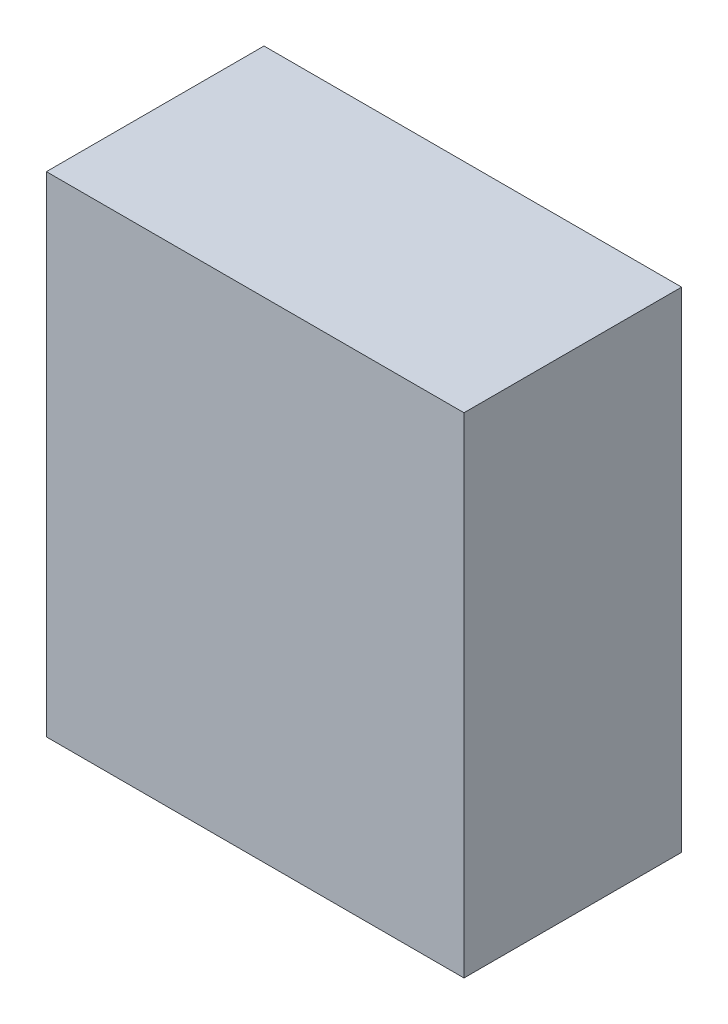
ISO-10303-21;
HEADER;
FILE_DESCRIPTION(('STEP AP214'),'2;1');
FILE_NAME('part.step','',(''),(''),'','','');
FILE_SCHEMA(('AUTOMOTIVE_DESIGN { 1 0 10303 214 1 1 1 1 }'));
ENDSEC;
DATA;
#1=APPLICATION_CONTEXT('core data for automotive mechanical design processes');
#2=APPLICATION_PROTOCOL_DEFINITION('international standard','automotive_design',2000,#1);
#3=PRODUCT_CONTEXT('',#1,'mechanical');
#4=PRODUCT('Part','Part','',(#3));
#5=PRODUCT_RELATED_PRODUCT_CATEGORY('part','',(#4));
#6=PRODUCT_DEFINITION_FORMATION('','',#4);
#7=PRODUCT_DEFINITION_CONTEXT('part definition',#1,'design');
#8=PRODUCT_DEFINITION('design','',#6,#7);
#9=PRODUCT_DEFINITION_SHAPE('','',#8);
#10=(LENGTH_UNIT() NAMED_UNIT(*) SI_UNIT(.MILLI.,.METRE.));
#11=(NAMED_UNIT(*) PLANE_ANGLE_UNIT() SI_UNIT($,.RADIAN.));
#12=(NAMED_UNIT(*) SI_UNIT($,.STERADIAN.) SOLID_ANGLE_UNIT());
#13=UNCERTAINTY_MEASURE_WITH_UNIT(LENGTH_MEASURE(1.E-05),#10,'distance_accuracy_value','');
#14=(GEOMETRIC_REPRESENTATION_CONTEXT(3) GLOBAL_UNCERTAINTY_ASSIGNED_CONTEXT((#13)) GLOBAL_UNIT_ASSIGNED_CONTEXT((#10,
#11,#12)) REPRESENTATION_CONTEXT('',''));
#15=CARTESIAN_POINT('',(0.,0.,0.));
#16=DIRECTION('',(0.,0.,1.));
#17=DIRECTION('',(1.,0.,0.));
#18=AXIS2_PLACEMENT_3D('',#15,#16,#17);
#19=CARTESIAN_POINT('',(4.50000116,-5.27500088,4.69));
#20=DIRECTION('',(0.,0.,-1.));
#21=DIRECTION('',(-1.,0.,0.));
#22=AXIS2_PLACEMENT_3D('',#19,#20,#21);
#23=PLANE('',#22);
#24=DIRECTION('',(1.,0.,0.));
#25=VECTOR('',#24,1.);
#26=CARTESIAN_POINT('',(4.50000116,5.27500088,4.69));
#27=LINE('',#26,#25);
#28=CARTESIAN_POINT('',(4.50000116,5.27500088,4.69));
#29=VERTEX_POINT('',#28);
#30=CARTESIAN_POINT('',(-4.49999862,5.27500088,4.69));
#31=VERTEX_POINT('',#30);
#32=EDGE_CURVE('E55',#29,#31,#27,.F.);
#33=ORIENTED_EDGE('',*,*,#32,.T.);
#34=DIRECTION('',(0.,1.,0.));
#35=VECTOR('',#34,1.);
#36=CARTESIAN_POINT('',(-4.49999862,5.27500088,4.69));
#37=LINE('',#36,#35);
#38=CARTESIAN_POINT('',(-4.49999862,-5.27500088,4.69));
#39=VERTEX_POINT('',#38);
#40=EDGE_CURVE('E57',#31,#39,#37,.F.);
#41=ORIENTED_EDGE('',*,*,#40,.T.);
#42=DIRECTION('',(1.,0.,0.));
#43=VECTOR('',#42,1.);
#44=CARTESIAN_POINT('',(-4.49999862,-5.27500088,4.69));
#45=LINE('',#44,#43);
#46=CARTESIAN_POINT('',(4.50000116,-5.27500088,4.69));
#47=VERTEX_POINT('',#46);
#48=EDGE_CURVE('E20',#39,#47,#45,.T.);
#49=ORIENTED_EDGE('',*,*,#48,.T.);
#50=DIRECTION('',(0.,1.,0.));
#51=VECTOR('',#50,1.);
#52=CARTESIAN_POINT('',(4.50000116,-5.27500088,4.69));
#53=LINE('',#52,#51);
#54=EDGE_CURVE('E80',#47,#29,#53,.T.);
#55=ORIENTED_EDGE('',*,*,#54,.T.);
#56=EDGE_LOOP('',(#33,#41,#49,#55));
#57=FACE_BOUND('',#56,.T.);
#58=ADVANCED_FACE('F17',(#57),#23,.F.);
#59=CARTESIAN_POINT('',(-4.49999862,-5.27500088,0.));
#60=DIRECTION('',(0.,1.,0.));
#61=DIRECTION('',(0.,0.,1.));
#62=AXIS2_PLACEMENT_3D('',#59,#60,#61);
#63=PLANE('',#62);
#64=DIRECTION('',(0.,0.,1.));
#65=VECTOR('',#64,1.);
#66=CARTESIAN_POINT('',(4.50000116,-5.27500088,0.));
#67=LINE('',#66,#65);
#68=CARTESIAN_POINT('',(4.50000116,-5.27500088,0.));
#69=VERTEX_POINT('',#68);
#70=EDGE_CURVE('E68',#69,#47,#67,.T.);
#71=ORIENTED_EDGE('',*,*,#70,.T.);
#72=ORIENTED_EDGE('',*,*,#48,.F.);
#73=DIRECTION('',(0.,0.,-1.));
#74=VECTOR('',#73,1.);
#75=CARTESIAN_POINT('',(-4.49999862,-5.27500088,0.));
#76=LINE('',#75,#74);
#77=CARTESIAN_POINT('',(-4.49999862,-5.27500088,0.));
#78=VERTEX_POINT('',#77);
#79=EDGE_CURVE('E63',#39,#78,#76,.T.);
#80=ORIENTED_EDGE('',*,*,#79,.T.);
#81=DIRECTION('',(-1.,0.,0.));
#82=VECTOR('',#81,1.);
#83=CARTESIAN_POINT('',(4.50000116,-5.27500088,0.));
#84=LINE('',#83,#82);
#85=EDGE_CURVE('E83',#69,#78,#84,.T.);
#86=ORIENTED_EDGE('',*,*,#85,.F.);
#87=EDGE_LOOP('',(#71,#72,#80,#86));
#88=FACE_BOUND('',#87,.T.);
#89=ADVANCED_FACE('F65',(#88),#63,.F.);
#90=CARTESIAN_POINT('',(-4.49999862,5.27500088,0.));
#91=DIRECTION('',(1.,0.,0.));
#92=DIRECTION('',(0.,0.,-1.));
#93=AXIS2_PLACEMENT_3D('',#90,#91,#92);
#94=PLANE('',#93);
#95=ORIENTED_EDGE('',*,*,#79,.F.);
#96=ORIENTED_EDGE('',*,*,#40,.F.);
#97=DIRECTION('',(0.,0.,-1.));
#98=VECTOR('',#97,1.);
#99=CARTESIAN_POINT('',(-4.49999862,5.27500088,0.));
#100=LINE('',#99,#98);
#101=CARTESIAN_POINT('',(-4.49999862,5.27500088,0.));
#102=VERTEX_POINT('',#101);
#103=EDGE_CURVE('E75',#31,#102,#100,.T.);
#104=ORIENTED_EDGE('',*,*,#103,.T.);
#105=DIRECTION('',(0.,1.,0.));
#106=VECTOR('',#105,1.);
#107=CARTESIAN_POINT('',(-4.49999862,-5.27500088,0.));
#108=LINE('',#107,#106);
#109=EDGE_CURVE('E72',#78,#102,#108,.T.);
#110=ORIENTED_EDGE('',*,*,#109,.F.);
#111=EDGE_LOOP('',(#95,#96,#104,#110));
#112=FACE_BOUND('',#111,.T.);
#113=ADVANCED_FACE('F70',(#112),#94,.F.);
#114=CARTESIAN_POINT('',(4.50000116,5.27500088,0.));
#115=DIRECTION('',(0.,-1.,0.));
#116=DIRECTION('',(0.,0.,-1.));
#117=AXIS2_PLACEMENT_3D('',#114,#115,#116);
#118=PLANE('',#117);
#119=ORIENTED_EDGE('',*,*,#103,.F.);
#120=ORIENTED_EDGE('',*,*,#32,.F.);
#121=DIRECTION('',(0.,0.,1.));
#122=VECTOR('',#121,1.);
#123=CARTESIAN_POINT('',(4.50000116,5.27500088,0.));
#124=LINE('',#123,#122);
#125=CARTESIAN_POINT('',(4.50000116,5.27500088,0.));
#126=VERTEX_POINT('',#125);
#127=EDGE_CURVE('E35',#29,#126,#124,.F.);
#128=ORIENTED_EDGE('',*,*,#127,.T.);
#129=DIRECTION('',(-1.,0.,0.));
#130=VECTOR('',#129,1.);
#131=CARTESIAN_POINT('',(4.50000116,5.27500088,0.));
#132=LINE('',#131,#130);
#133=EDGE_CURVE('E26',#102,#126,#132,.F.);
#134=ORIENTED_EDGE('',*,*,#133,.F.);
#135=EDGE_LOOP('',(#119,#120,#128,#134));
#136=FACE_BOUND('',#135,.T.);
#137=ADVANCED_FACE('F89',(#136),#118,.F.);
#138=CARTESIAN_POINT('',(4.50000116,-5.27500088,0.));
#139=DIRECTION('',(-1.,0.,0.));
#140=DIRECTION('',(0.,0.,1.));
#141=AXIS2_PLACEMENT_3D('',#138,#139,#140);
#142=PLANE('',#141);
#143=ORIENTED_EDGE('',*,*,#127,.F.);
#144=ORIENTED_EDGE('',*,*,#54,.F.);
#145=ORIENTED_EDGE('',*,*,#70,.F.);
#146=DIRECTION('',(0.,1.,0.));
#147=VECTOR('',#146,1.);
#148=CARTESIAN_POINT('',(4.50000116,-5.27500088,0.));
#149=LINE('',#148,#147);
#150=EDGE_CURVE('E11',#126,#69,#149,.F.);
#151=ORIENTED_EDGE('',*,*,#150,.F.);
#152=EDGE_LOOP('',(#143,#144,#145,#151));
#153=FACE_BOUND('',#152,.T.);
#154=ADVANCED_FACE('F91',(#153),#142,.F.);
#155=CARTESIAN_POINT('',(4.50000116,-5.27500088,0.));
#156=DIRECTION('',(0.,0.,-1.));
#157=DIRECTION('',(-1.,0.,0.));
#158=AXIS2_PLACEMENT_3D('',#155,#156,#157);
#159=PLANE('',#158);
#160=ORIENTED_EDGE('',*,*,#133,.T.);
#161=ORIENTED_EDGE('',*,*,#150,.T.);
#162=ORIENTED_EDGE('',*,*,#85,.T.);
#163=ORIENTED_EDGE('',*,*,#109,.T.);
#164=EDGE_LOOP('',(#160,#161,#162,#163));
#165=FACE_BOUND('',#164,.T.);
#166=ADVANCED_FACE('F88',(#165),#159,.T.);
#167=CLOSED_SHELL('',(#58,#89,#113,#137,#154,#166));
#168=MANIFOLD_SOLID_BREP('B1',#167);
#169=ADVANCED_BREP_SHAPE_REPRESENTATION('',(#18,#168),#14);
#170=SHAPE_DEFINITION_REPRESENTATION(#9,#169);
ENDSEC;
END-ISO-10303-21;
